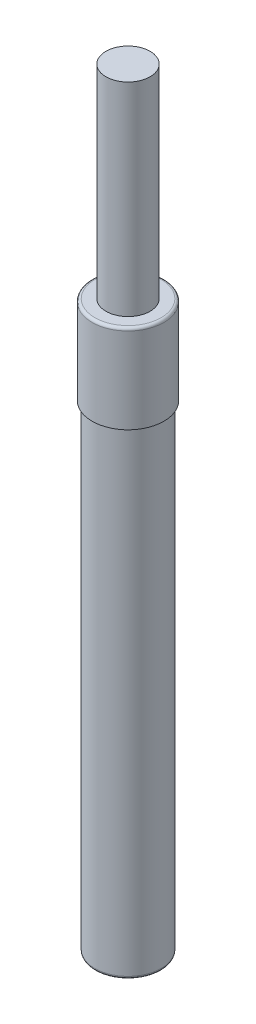
ISO-10303-21;
HEADER;
FILE_DESCRIPTION(('STEP AP214'),'2;1');
FILE_NAME('part.step','',(''),(''),'','','');
FILE_SCHEMA(('AUTOMOTIVE_DESIGN { 1 0 10303 214 1 1 1 1 }'));
ENDSEC;
DATA;
#1=APPLICATION_CONTEXT('core data for automotive mechanical design processes');
#2=APPLICATION_PROTOCOL_DEFINITION('international standard','automotive_design',2000,#1);
#3=PRODUCT_CONTEXT('',#1,'mechanical');
#4=PRODUCT('Part','Part','',(#3));
#5=PRODUCT_RELATED_PRODUCT_CATEGORY('part','',(#4));
#6=PRODUCT_DEFINITION_FORMATION('','',#4);
#7=PRODUCT_DEFINITION_CONTEXT('part definition',#1,'design');
#8=PRODUCT_DEFINITION('design','',#6,#7);
#9=PRODUCT_DEFINITION_SHAPE('','',#8);
#10=(LENGTH_UNIT() NAMED_UNIT(*) SI_UNIT(.MILLI.,.METRE.));
#11=(NAMED_UNIT(*) PLANE_ANGLE_UNIT() SI_UNIT($,.RADIAN.));
#12=(NAMED_UNIT(*) SI_UNIT($,.STERADIAN.) SOLID_ANGLE_UNIT());
#13=UNCERTAINTY_MEASURE_WITH_UNIT(LENGTH_MEASURE(1.E-05),#10,'distance_accuracy_value','');
#14=(GEOMETRIC_REPRESENTATION_CONTEXT(3) GLOBAL_UNCERTAINTY_ASSIGNED_CONTEXT((#13)) GLOBAL_UNIT_ASSIGNED_CONTEXT((#10,
#11,#12)) REPRESENTATION_CONTEXT('',''));
#15=CARTESIAN_POINT('',(0.,0.,0.));
#16=DIRECTION('',(0.,0.,1.));
#17=DIRECTION('',(1.,0.,0.));
#18=AXIS2_PLACEMENT_3D('',#15,#16,#17);
#19=CARTESIAN_POINT('',(0.,17.75,0.));
#20=DIRECTION('',(0.,-1.,0.));
#21=DIRECTION('',(1.,0.,0.));
#22=AXIS2_PLACEMENT_3D('',#19,#20,#21);
#23=TOROIDAL_SURFACE('',#22,3.00000000000004,0.25);
#24=CARTESIAN_POINT('',(0.,18.,0.));
#25=DIRECTION('',(0.,-1.,0.));
#26=DIRECTION('',(1.,0.,0.));
#27=AXIS2_PLACEMENT_3D('',#24,#25,#26);
#28=CIRCLE('',#27,3.00000000000004);
#29=CARTESIAN_POINT('',(3.00000000000011,18.,0.));
#30=VERTEX_POINT('',#29);
#31=EDGE_CURVE('E10',#30,#30,#28,.T.);
#32=ORIENTED_EDGE('',*,*,#31,.T.);
#33=EDGE_LOOP('',(#32));
#34=FACE_BOUND('',#33,.T.);
#35=CARTESIAN_POINT('',(0.,17.75,0.));
#36=DIRECTION('',(0.,-1.,0.));
#37=DIRECTION('',(1.,0.,0.));
#38=AXIS2_PLACEMENT_3D('',#35,#36,#37);
#39=CIRCLE('',#38,3.25000000000004);
#40=CARTESIAN_POINT('',(3.25000000000011,17.75,0.));
#41=VERTEX_POINT('',#40);
#42=EDGE_CURVE('E79',#41,#41,#39,.T.);
#43=ORIENTED_EDGE('',*,*,#42,.F.);
#44=EDGE_LOOP('',(#43));
#45=FACE_BOUND('',#44,.T.);
#46=ADVANCED_FACE('F16',(#34,#45),#23,.T.);
#47=CARTESIAN_POINT('',(-2.,18.,0.));
#48=DIRECTION('',(0.,-1.,0.));
#49=DIRECTION('',(0.,0.,-1.));
#50=AXIS2_PLACEMENT_3D('',#47,#48,#49);
#51=PLANE('',#50);
#52=CARTESIAN_POINT('',(0.,18.,0.));
#53=DIRECTION('',(0.,-1.,0.));
#54=DIRECTION('',(1.,0.,0.));
#55=AXIS2_PLACEMENT_3D('',#52,#53,#54);
#56=CIRCLE('',#55,2.00000000000008);
#57=CARTESIAN_POINT('',(2.00000000000015,18.,0.));
#58=VERTEX_POINT('',#57);
#59=EDGE_CURVE('E26',#58,#58,#56,.T.);
#60=ORIENTED_EDGE('',*,*,#59,.T.);
#61=EDGE_LOOP('',(#60));
#62=FACE_BOUND('',#61,.T.);
#63=ORIENTED_EDGE('',*,*,#31,.F.);
#64=EDGE_LOOP('',(#63));
#65=FACE_BOUND('',#64,.T.);
#66=ADVANCED_FACE('F107',(#62,#65),#51,.F.);
#67=CARTESIAN_POINT('',(0.,28.,0.));
#68=DIRECTION('',(0.,-1.,0.));
#69=DIRECTION('',(1.,0.,0.));
#70=AXIS2_PLACEMENT_3D('',#67,#68,#69);
#71=CYLINDRICAL_SURFACE('',#70,2.00000000000008);
#72=CARTESIAN_POINT('',(0.,36.4,0.));
#73=DIRECTION('',(0.,-1.,0.));
#74=DIRECTION('',(1.,0.,0.));
#75=AXIS2_PLACEMENT_3D('',#72,#73,#74);
#76=CIRCLE('',#75,2.00000000000008);
#77=CARTESIAN_POINT('',(2.00000000000015,36.4,0.));
#78=VERTEX_POINT('',#77);
#79=EDGE_CURVE('E52',#78,#78,#76,.T.);
#80=ORIENTED_EDGE('',*,*,#79,.T.);
#81=EDGE_LOOP('',(#80));
#82=FACE_BOUND('',#81,.T.);
#83=ORIENTED_EDGE('',*,*,#59,.F.);
#84=EDGE_LOOP('',(#83));
#85=FACE_BOUND('',#84,.T.);
#86=ADVANCED_FACE('F110',(#82,#85),#71,.T.);
#87=CARTESIAN_POINT('',(0.,36.4,0.));
#88=DIRECTION('',(0.,-1.,0.));
#89=DIRECTION('',(0.,0.,-1.));
#90=AXIS2_PLACEMENT_3D('',#87,#88,#89);
#91=PLANE('',#90);
#92=ORIENTED_EDGE('',*,*,#79,.F.);
#93=EDGE_LOOP('',(#92));
#94=FACE_BOUND('',#93,.T.);
#95=ADVANCED_FACE('F112',(#94),#91,.F.);
#96=CARTESIAN_POINT('',(-2.75,-33.3,0.));
#97=DIRECTION('',(0.,1.,0.));
#98=DIRECTION('',(1.,0.,0.));
#99=AXIS2_PLACEMENT_3D('',#96,#97,#98);
#100=PLANE('',#99);
#101=CARTESIAN_POINT('',(0.,-33.3,0.));
#102=DIRECTION('',(0.,-1.,0.));
#103=DIRECTION('',(1.,0.,0.));
#104=AXIS2_PLACEMENT_3D('',#101,#102,#103);
#105=CIRCLE('',#104,2.75000000000008);
#106=CARTESIAN_POINT('',(2.75000000000016,-33.3,0.));
#107=VERTEX_POINT('',#106);
#108=EDGE_CURVE('E59',#107,#107,#105,.T.);
#109=ORIENTED_EDGE('',*,*,#108,.T.);
#110=EDGE_LOOP('',(#109));
#111=FACE_BOUND('',#110,.T.);
#112=ADVANCED_FACE('F119',(#111),#100,.F.);
#113=CARTESIAN_POINT('',(0.,-33.05,0.));
#114=DIRECTION('',(0.,-1.,0.));
#115=DIRECTION('',(1.,0.,0.));
#116=AXIS2_PLACEMENT_3D('',#113,#114,#115);
#117=TOROIDAL_SURFACE('',#116,2.75000000000008,0.25);
#118=CARTESIAN_POINT('',(0.,-33.05,0.));
#119=DIRECTION('',(0.,-1.,0.));
#120=DIRECTION('',(1.,0.,0.));
#121=AXIS2_PLACEMENT_3D('',#118,#119,#120);
#122=CIRCLE('',#121,3.00000000000008);
#123=CARTESIAN_POINT('',(3.00000000000016,-33.05,0.));
#124=VERTEX_POINT('',#123);
#125=EDGE_CURVE('E69',#124,#124,#122,.T.);
#126=ORIENTED_EDGE('',*,*,#125,.T.);
#127=EDGE_LOOP('',(#126));
#128=FACE_BOUND('',#127,.T.);
#129=ORIENTED_EDGE('',*,*,#108,.F.);
#130=EDGE_LOOP('',(#129));
#131=FACE_BOUND('',#130,.T.);
#132=ADVANCED_FACE('F159',(#128,#131),#117,.T.);
#133=CARTESIAN_POINT('',(0.,28.,0.));
#134=DIRECTION('',(0.,-1.,0.));
#135=DIRECTION('',(1.,0.,0.));
#136=AXIS2_PLACEMENT_3D('',#133,#134,#135);
#137=CYLINDRICAL_SURFACE('',#136,3.00000000000008);
#138=CARTESIAN_POINT('',(0.,10.,0.));
#139=DIRECTION('',(0.,-1.,0.));
#140=DIRECTION('',(1.,0.,0.));
#141=AXIS2_PLACEMENT_3D('',#138,#139,#140);
#142=CIRCLE('',#141,3.00000000000009);
#143=CARTESIAN_POINT('',(3.00000000000017,10.,0.));
#144=VERTEX_POINT('',#143);
#145=EDGE_CURVE('E19',#144,#144,#142,.T.);
#146=ORIENTED_EDGE('',*,*,#145,.T.);
#147=EDGE_LOOP('',(#146));
#148=FACE_BOUND('',#147,.T.);
#149=ORIENTED_EDGE('',*,*,#125,.F.);
#150=EDGE_LOOP('',(#149));
#151=FACE_BOUND('',#150,.T.);
#152=ADVANCED_FACE('F168',(#148,#151),#137,.T.);
#153=CARTESIAN_POINT('',(-3.24999999999996,10.,0.));
#154=DIRECTION('',(0.,1.,0.));
#155=DIRECTION('',(1.,0.,0.));
#156=AXIS2_PLACEMENT_3D('',#153,#154,#155);
#157=PLANE('',#156);
#158=CARTESIAN_POINT('',(0.,10.,0.));
#159=DIRECTION('',(0.,-1.,0.));
#160=DIRECTION('',(1.,0.,0.));
#161=AXIS2_PLACEMENT_3D('',#158,#159,#160);
#162=CIRCLE('',#161,3.25);
#163=CARTESIAN_POINT('',(3.25000000000011,10.,0.));
#164=VERTEX_POINT('',#163);
#165=EDGE_CURVE('E84',#164,#164,#162,.T.);
#166=ORIENTED_EDGE('',*,*,#165,.T.);
#167=EDGE_LOOP('',(#166));
#168=FACE_BOUND('',#167,.T.);
#169=ORIENTED_EDGE('',*,*,#145,.F.);
#170=EDGE_LOOP('',(#169));
#171=FACE_BOUND('',#170,.T.);
#172=ADVANCED_FACE('F177',(#168,#171),#157,.F.);
#173=CARTESIAN_POINT('',(0.,28.,0.));
#174=DIRECTION('',(0.,-1.,0.));
#175=DIRECTION('',(1.,0.,0.));
#176=AXIS2_PLACEMENT_3D('',#173,#174,#175);
#177=CYLINDRICAL_SURFACE('',#176,3.25000000000004);
#178=ORIENTED_EDGE('',*,*,#42,.T.);
#179=EDGE_LOOP('',(#178));
#180=FACE_BOUND('',#179,.T.);
#181=ORIENTED_EDGE('',*,*,#165,.F.);
#182=EDGE_LOOP('',(#181));
#183=FACE_BOUND('',#182,.T.);
#184=ADVANCED_FACE('F80',(#180,#183),#177,.T.);
#185=CLOSED_SHELL('',(#46,#66,#86,#95,#112,#132,#152,#172,#184));
#186=MANIFOLD_SOLID_BREP('B1',#185);
#187=ADVANCED_BREP_SHAPE_REPRESENTATION('',(#18,#186),#14);
#188=SHAPE_DEFINITION_REPRESENTATION(#9,#187);
ENDSEC;
END-ISO-10303-21;
